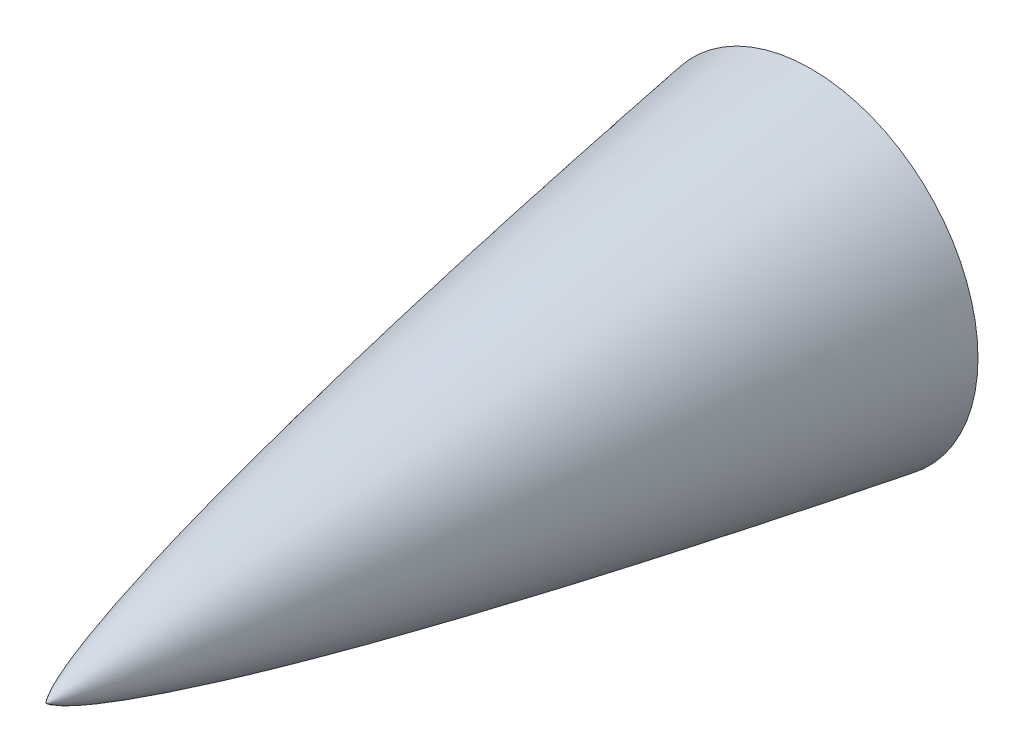
ISO-10303-21;
HEADER;
FILE_DESCRIPTION(('STEP AP214'),'2;1');
FILE_NAME('part.step','',(''),(''),'','','');
FILE_SCHEMA(('AUTOMOTIVE_DESIGN { 1 0 10303 214 1 1 1 1 }'));
ENDSEC;
DATA;
#1=APPLICATION_CONTEXT('core data for automotive mechanical design processes');
#2=APPLICATION_PROTOCOL_DEFINITION('international standard','automotive_design',2000,#1);
#3=PRODUCT_CONTEXT('',#1,'mechanical');
#4=PRODUCT('Part','Part','',(#3));
#5=PRODUCT_RELATED_PRODUCT_CATEGORY('part','',(#4));
#6=PRODUCT_DEFINITION_FORMATION('','',#4);
#7=PRODUCT_DEFINITION_CONTEXT('part definition',#1,'design');
#8=PRODUCT_DEFINITION('design','',#6,#7);
#9=PRODUCT_DEFINITION_SHAPE('','',#8);
#10=(LENGTH_UNIT() NAMED_UNIT(*) SI_UNIT(.MILLI.,.METRE.));
#11=(NAMED_UNIT(*) PLANE_ANGLE_UNIT() SI_UNIT($,.RADIAN.));
#12=(NAMED_UNIT(*) SI_UNIT($,.STERADIAN.) SOLID_ANGLE_UNIT());
#13=UNCERTAINTY_MEASURE_WITH_UNIT(LENGTH_MEASURE(1.E-05),#10,'distance_accuracy_value','');
#14=(GEOMETRIC_REPRESENTATION_CONTEXT(3) GLOBAL_UNCERTAINTY_ASSIGNED_CONTEXT((#13)) GLOBAL_UNIT_ASSIGNED_CONTEXT((#10,
#11,#12)) REPRESENTATION_CONTEXT('',''));
#15=CARTESIAN_POINT('',(0.,0.,0.));
#16=DIRECTION('',(0.,0.,1.));
#17=DIRECTION('',(1.,0.,0.));
#18=AXIS2_PLACEMENT_3D('',#15,#16,#17);
#19=CARTESIAN_POINT('',(0.,0.,0.));
#20=CARTESIAN_POINT('',(0.,0.00758917872915185,-0.00273265982398566));
#21=CARTESIAN_POINT('',(0.,0.0218813580631926,-0.00991845888765705));
#22=CARTESIAN_POINT('',(0.,0.0451301597904087,-0.0285990217319021));
#23=CARTESIAN_POINT('',(0.,0.0761902454337581,-0.0581598529571329));
#24=CARTESIAN_POINT('',(0.,0.112001744938427,-0.0980688621800041));
#25=CARTESIAN_POINT('',(0.,0.157289412809315,-0.154490996481366));
#26=CARTESIAN_POINT('',(0.,0.216844640070994,-0.237015744149377));
#27=CARTESIAN_POINT('',(0.,0.302486024802654,-0.36906621672681));
#28=CARTESIAN_POINT('',(0.,0.428563317279334,-0.586708145543816));
#29=CARTESIAN_POINT('',(0.,0.621069750519857,-0.961032304858373));
#30=CARTESIAN_POINT('',(0.,0.918059516566241,-1.61640993736818));
#31=CARTESIAN_POINT('',(0.,1.37615235864187,-2.77196300112333));
#32=CARTESIAN_POINT('',(0.,2.04523907322696,-4.70858130371785));
#33=CARTESIAN_POINT('',(0.,2.99536914787007,-7.85026569388279));
#34=CARTESIAN_POINT('',(0.,4.11906385053809,-12.0729898404431));
#35=CARTESIAN_POINT('',(0.,5.33503627892517,-17.1358065039826));
#36=CARTESIAN_POINT('',(0.,6.56888453462532,-22.7174979714412));
#37=CARTESIAN_POINT('',(0.,7.72936441256768,-28.3161630122836));
#38=CARTESIAN_POINT('',(0.,8.83181843953449,-33.9243517312156));
#39=CARTESIAN_POINT('',(0.,9.88782584764453,-39.5449699722526));
#40=CARTESIAN_POINT('',(0.,10.9032724862931,-45.1670430009791));
#41=CARTESIAN_POINT('',(0.,11.7633253345546,-50.1010723820211));
#42=CARTESIAN_POINT('',(0.,12.4794311930698,-54.3184156769924));
#43=CARTESIAN_POINT('',(0.,13.0683193917187,-57.8586609561044));
#44=CARTESIAN_POINT('',(0.,13.5264117892838,-60.6493053674893));
#45=CARTESIAN_POINT('',(0.,13.991405810956,-63.5272107230464));
#46=CARTESIAN_POINT('',(0.,14.4271898227875,-66.2527430957714));
#47=CARTESIAN_POINT('',(0.,14.8970013306765,-69.2402424138729));
#48=CARTESIAN_POINT('',(0.,15.2941922030843,-71.7861778033149));
#49=CARTESIAN_POINT('',(0.,15.6747390664779,-74.2657413897848));
#50=CARTESIAN_POINT('',(0.,15.8717697776707,-75.556994429288));
#51=CARTESIAN_POINT('',(0.,15.9694711944715,-76.1999999999999));
#52=B_SPLINE_CURVE_WITH_KNOTS('',4,(#19,#20,#21,#22,#23,#24,#25,#26,#27,#28,#29,#30,#31,#32,#33,
#34,#35,#36,#37,#38,#39,#40,#41,#42,#43,#44,#45,#46,#47,#48,#49,#50,#51),.UNSPECIFIED.,.F.,.F.,
(5,1,1,1,1,1,1,1,1,1,1,1,1,1,1,1,1,1,1,1,1,1,1,1,1,1,1,1,1,5),(0.,0.00037461183522945,
0.0007492236704589,0.00137782472826252,0.00200414164704283,0.0028707846348406,
0.00412451668740252,0.00612215300029428,0.00934345509113493,0.0145985207998741,
0.0237512901738123,0.0396737493739831,0.0673053407677174,0.110150453746214,0.176816979250079,
0.243483507480706,0.31015004214912,0.376816576311917,0.443483109888871,0.510149643214885,
0.576816176383814,0.643482711489811,0.676815978521881,0.710149245553952,0.743482512243285,
0.776815778932618,0.810149046315003,0.843482313697388,0.876815580331093,0.910148846964798),.UNSPECIFIED.);
#53=CARTESIAN_POINT('',(0.,0.,-76.1999999999999));
#54=DIRECTION('',(0.,0.,-1.));
#55=AXIS1_PLACEMENT('',#53,#54);
#56=SURFACE_OF_REVOLUTION('',#52,#55);
#57=CARTESIAN_POINT('',(0.,0.,-65.786));
#58=DIRECTION('',(0.,0.,-1.));
#59=DIRECTION('',(0.,1.,0.));
#60=AXIS2_PLACEMENT_3D('',#57,#58,#59);
#61=CIRCLE('',#60,14.3515415604193);
#62=CARTESIAN_POINT('',(0.,14.3515415604193,-65.786));
#63=VERTEX_POINT('',#62);
#64=EDGE_CURVE('E11',#63,#63,#61,.T.);
#65=ORIENTED_EDGE('',*,*,#64,.F.);
#66=EDGE_LOOP('',(#65));
#67=FACE_BOUND('',#66,.T.);
#68=CARTESIAN_POINT('',(0.,0.,0.));
#69=VERTEX_POINT('',#68);
#70=VERTEX_LOOP('',#69);
#71=FACE_BOUND('',#70,.T.);
#72=ADVANCED_FACE('F43',(#67,#71),#56,.T.);
#73=CARTESIAN_POINT('',(0.,0.,-65.786));
#74=DIRECTION('',(0.,0.,-1.));
#75=DIRECTION('',(0.,1.,0.));
#76=AXIS2_PLACEMENT_3D('',#73,#74,#75);
#77=PLANE('',#76);
#78=CARTESIAN_POINT('',(0.,0.,-65.786));
#79=DIRECTION('',(0.,0.,-1.));
#80=DIRECTION('',(0.,1.,0.));
#81=AXIS2_PLACEMENT_3D('',#78,#79,#80);
#82=CIRCLE('',#81,2.5527);
#83=CARTESIAN_POINT('',(0.,2.55270000000001,-65.786));
#84=VERTEX_POINT('',#83);
#85=EDGE_CURVE('E66',#84,#84,#82,.T.);
#86=ORIENTED_EDGE('',*,*,#85,.F.);
#87=EDGE_LOOP('',(#86));
#88=FACE_BOUND('',#87,.T.);
#89=ORIENTED_EDGE('',*,*,#64,.T.);
#90=EDGE_LOOP('',(#89));
#91=FACE_BOUND('',#90,.T.);
#92=ADVANCED_FACE('F61',(#88,#91),#77,.T.);
#93=CARTESIAN_POINT('',(0.,0.,-45.974));
#94=DIRECTION('',(0.,0.,-1.));
#95=DIRECTION('',(0.,1.,0.));
#96=AXIS2_PLACEMENT_3D('',#93,#94,#95);
#97=CONICAL_SURFACE('',#96,2.5527,1.02974425867665);
#98=CARTESIAN_POINT('',(0.,0.,-44.4401830978083));
#99=VERTEX_POINT('',#98);
#100=VERTEX_LOOP('',#99);
#101=FACE_BOUND('',#100,.T.);
#102=CARTESIAN_POINT('',(0.,0.,-45.974));
#103=DIRECTION('',(0.,0.,-1.));
#104=DIRECTION('',(0.,1.,0.));
#105=AXIS2_PLACEMENT_3D('',#102,#103,#104);
#106=CIRCLE('',#105,2.5527);
#107=CARTESIAN_POINT('',(0.,2.5527,-45.974));
#108=VERTEX_POINT('',#107);
#109=EDGE_CURVE('E51',#108,#108,#106,.T.);
#110=ORIENTED_EDGE('',*,*,#109,.T.);
#111=EDGE_LOOP('',(#110));
#112=FACE_BOUND('',#111,.T.);
#113=ADVANCED_FACE('F57',(#101,#112),#97,.F.);
#114=CARTESIAN_POINT('',(0.,0.,-65.786));
#115=DIRECTION('',(0.,0.,-1.));
#116=DIRECTION('',(0.,1.,0.));
#117=AXIS2_PLACEMENT_3D('',#114,#115,#116);
#118=CYLINDRICAL_SURFACE('',#117,2.5527);
#119=ORIENTED_EDGE('',*,*,#109,.F.);
#120=EDGE_LOOP('',(#119));
#121=FACE_BOUND('',#120,.T.);
#122=ORIENTED_EDGE('',*,*,#85,.T.);
#123=EDGE_LOOP('',(#122));
#124=FACE_BOUND('',#123,.T.);
#125=ADVANCED_FACE('F60',(#121,#124),#118,.F.);
#126=CLOSED_SHELL('',(#72,#92,#113,#125));
#127=MANIFOLD_SOLID_BREP('B2',#126);
#128=ADVANCED_BREP_SHAPE_REPRESENTATION('',(#18,#127),#14);
#129=SHAPE_DEFINITION_REPRESENTATION(#9,#128);
ENDSEC;
END-ISO-10303-21;
